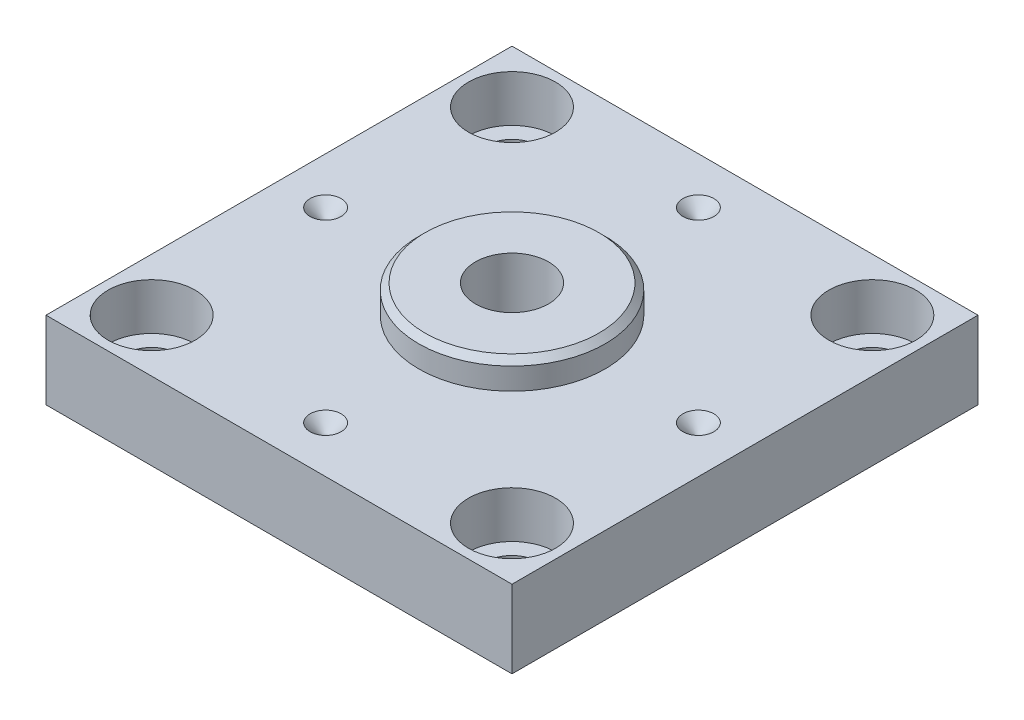
ISO-10303-21;
HEADER;
FILE_DESCRIPTION(('STEP AP214'),'2;1');
FILE_NAME('part.step','',(''),(''),'','','');
FILE_SCHEMA(('AUTOMOTIVE_DESIGN { 1 0 10303 214 1 1 1 1 }'));
ENDSEC;
DATA;
#1=APPLICATION_CONTEXT('core data for automotive mechanical design processes');
#2=APPLICATION_PROTOCOL_DEFINITION('international standard','automotive_design',2000,#1);
#3=PRODUCT_CONTEXT('',#1,'mechanical');
#4=PRODUCT('Part','Part','',(#3));
#5=PRODUCT_RELATED_PRODUCT_CATEGORY('part','',(#4));
#6=PRODUCT_DEFINITION_FORMATION('','',#4);
#7=PRODUCT_DEFINITION_CONTEXT('part definition',#1,'design');
#8=PRODUCT_DEFINITION('design','',#6,#7);
#9=PRODUCT_DEFINITION_SHAPE('','',#8);
#10=(LENGTH_UNIT() NAMED_UNIT(*) SI_UNIT(.MILLI.,.METRE.));
#11=(NAMED_UNIT(*) PLANE_ANGLE_UNIT() SI_UNIT($,.RADIAN.));
#12=(NAMED_UNIT(*) SI_UNIT($,.STERADIAN.) SOLID_ANGLE_UNIT());
#13=UNCERTAINTY_MEASURE_WITH_UNIT(LENGTH_MEASURE(1.E-05),#10,'distance_accuracy_value','');
#14=(GEOMETRIC_REPRESENTATION_CONTEXT(3) GLOBAL_UNCERTAINTY_ASSIGNED_CONTEXT((#13)) GLOBAL_UNIT_ASSIGNED_CONTEXT((#10,
#11,#12)) REPRESENTATION_CONTEXT('',''));
#15=CARTESIAN_POINT('',(0.,0.,0.));
#16=DIRECTION('',(0.,0.,1.));
#17=DIRECTION('',(1.,0.,0.));
#18=AXIS2_PLACEMENT_3D('',#15,#16,#17);
#19=CARTESIAN_POINT('',(-75.,25.,-75.));
#20=DIRECTION('',(1.,0.,0.));
#21=DIRECTION('',(0.,0.,-1.));
#22=AXIS2_PLACEMENT_3D('',#19,#20,#21);
#23=PLANE('',#22);
#24=DIRECTION('',(0.,0.,1.));
#25=VECTOR('',#24,1.);
#26=CARTESIAN_POINT('',(-75.,0.,-75.));
#27=LINE('',#26,#25);
#28=CARTESIAN_POINT('',(-75.,0.,-75.));
#29=VERTEX_POINT('',#28);
#30=CARTESIAN_POINT('',(-75.,0.,75.));
#31=VERTEX_POINT('',#30);
#32=EDGE_CURVE('E205',#29,#31,#27,.T.);
#33=ORIENTED_EDGE('',*,*,#32,.T.);
#34=DIRECTION('',(0.,-1.,0.));
#35=VECTOR('',#34,1.);
#36=CARTESIAN_POINT('',(-75.,25.,75.));
#37=LINE('',#36,#35);
#38=CARTESIAN_POINT('',(-75.,25.,75.));
#39=VERTEX_POINT('',#38);
#40=EDGE_CURVE('E210',#39,#31,#37,.T.);
#41=ORIENTED_EDGE('',*,*,#40,.F.);
#42=DIRECTION('',(0.,0.,1.));
#43=VECTOR('',#42,1.);
#44=CARTESIAN_POINT('',(-75.,25.,-75.));
#45=LINE('',#44,#43);
#46=CARTESIAN_POINT('',(-75.,25.,-75.));
#47=VERTEX_POINT('',#46);
#48=EDGE_CURVE('E211',#47,#39,#45,.T.);
#49=ORIENTED_EDGE('',*,*,#48,.F.);
#50=DIRECTION('',(0.,-1.,0.));
#51=VECTOR('',#50,1.);
#52=CARTESIAN_POINT('',(-75.,25.,-75.));
#53=LINE('',#52,#51);
#54=EDGE_CURVE('E221',#47,#29,#53,.T.);
#55=ORIENTED_EDGE('',*,*,#54,.T.);
#56=EDGE_LOOP('',(#33,#41,#49,#55));
#57=FACE_BOUND('',#56,.T.);
#58=ADVANCED_FACE('F45',(#57),#23,.F.);
#59=CARTESIAN_POINT('',(75.,25.,75.));
#60=DIRECTION('',(0.,0.,-1.));
#61=DIRECTION('',(-1.,0.,0.));
#62=AXIS2_PLACEMENT_3D('',#59,#60,#61);
#63=PLANE('',#62);
#64=DIRECTION('',(1.,0.,0.));
#65=VECTOR('',#64,1.);
#66=CARTESIAN_POINT('',(75.,0.,75.));
#67=LINE('',#66,#65);
#68=CARTESIAN_POINT('',(75.,0.,75.));
#69=VERTEX_POINT('',#68);
#70=EDGE_CURVE('E225',#31,#69,#67,.T.);
#71=ORIENTED_EDGE('',*,*,#70,.T.);
#72=DIRECTION('',(0.,-1.,0.));
#73=VECTOR('',#72,1.);
#74=CARTESIAN_POINT('',(75.,25.,75.));
#75=LINE('',#74,#73);
#76=CARTESIAN_POINT('',(75.,25.,75.));
#77=VERTEX_POINT('',#76);
#78=EDGE_CURVE('E237',#77,#69,#75,.T.);
#79=ORIENTED_EDGE('',*,*,#78,.F.);
#80=DIRECTION('',(1.,0.,0.));
#81=VECTOR('',#80,1.);
#82=CARTESIAN_POINT('',(75.,25.,75.));
#83=LINE('',#82,#81);
#84=EDGE_CURVE('E96',#39,#77,#83,.T.);
#85=ORIENTED_EDGE('',*,*,#84,.F.);
#86=ORIENTED_EDGE('',*,*,#40,.T.);
#87=EDGE_LOOP('',(#71,#79,#85,#86));
#88=FACE_BOUND('',#87,.T.);
#89=ADVANCED_FACE('F262',(#88),#63,.F.);
#90=CARTESIAN_POINT('',(75.,25.,-75.));
#91=DIRECTION('',(-1.,0.,0.));
#92=DIRECTION('',(0.,0.,1.));
#93=AXIS2_PLACEMENT_3D('',#90,#91,#92);
#94=PLANE('',#93);
#95=DIRECTION('',(0.,0.,-1.));
#96=VECTOR('',#95,1.);
#97=CARTESIAN_POINT('',(75.,0.,-75.));
#98=LINE('',#97,#96);
#99=CARTESIAN_POINT('',(75.,0.,-75.));
#100=VERTEX_POINT('',#99);
#101=EDGE_CURVE('E82',#69,#100,#98,.T.);
#102=ORIENTED_EDGE('',*,*,#101,.T.);
#103=DIRECTION('',(0.,-1.,0.));
#104=VECTOR('',#103,1.);
#105=CARTESIAN_POINT('',(75.,25.,-75.));
#106=LINE('',#105,#104);
#107=CARTESIAN_POINT('',(75.,25.,-75.));
#108=VERTEX_POINT('',#107);
#109=EDGE_CURVE('E234',#108,#100,#106,.T.);
#110=ORIENTED_EDGE('',*,*,#109,.F.);
#111=DIRECTION('',(0.,0.,-1.));
#112=VECTOR('',#111,1.);
#113=CARTESIAN_POINT('',(75.,25.,-75.));
#114=LINE('',#113,#112);
#115=EDGE_CURVE('E216',#77,#108,#114,.T.);
#116=ORIENTED_EDGE('',*,*,#115,.F.);
#117=ORIENTED_EDGE('',*,*,#78,.T.);
#118=EDGE_LOOP('',(#102,#110,#116,#117));
#119=FACE_BOUND('',#118,.T.);
#120=ADVANCED_FACE('F267',(#119),#94,.F.);
#121=CARTESIAN_POINT('',(75.,25.,-75.));
#122=DIRECTION('',(0.,0.,1.));
#123=DIRECTION('',(1.,0.,0.));
#124=AXIS2_PLACEMENT_3D('',#121,#122,#123);
#125=PLANE('',#124);
#126=DIRECTION('',(-1.,0.,0.));
#127=VECTOR('',#126,1.);
#128=CARTESIAN_POINT('',(75.,0.,-75.));
#129=LINE('',#128,#127);
#130=EDGE_CURVE('E88',#100,#29,#129,.T.);
#131=ORIENTED_EDGE('',*,*,#130,.T.);
#132=ORIENTED_EDGE('',*,*,#54,.F.);
#133=DIRECTION('',(-1.,0.,0.));
#134=VECTOR('',#133,1.);
#135=CARTESIAN_POINT('',(75.,25.,-75.));
#136=LINE('',#135,#134);
#137=EDGE_CURVE('E64',#108,#47,#136,.T.);
#138=ORIENTED_EDGE('',*,*,#137,.F.);
#139=ORIENTED_EDGE('',*,*,#109,.T.);
#140=EDGE_LOOP('',(#131,#132,#138,#139));
#141=FACE_BOUND('',#140,.T.);
#142=ADVANCED_FACE('F272',(#141),#125,.F.);
#143=CARTESIAN_POINT('',(0.,25.,0.));
#144=DIRECTION('',(0.,-1.,0.));
#145=DIRECTION('',(0.,0.,-1.));
#146=AXIS2_PLACEMENT_3D('',#143,#144,#145);
#147=PLANE('',#146);
#148=CARTESIAN_POINT('',(-6.28466640991764E-13,25.,-60.));
#149=DIRECTION('',(0.,-1.,0.));
#150=DIRECTION('',(0.,0.,1.));
#151=AXIS2_PLACEMENT_3D('',#148,#149,#150);
#152=CIRCLE('',#151,5.);
#153=CARTESIAN_POINT('',(-5.76094420909117E-13,25.,-55.));
#154=VERTEX_POINT('',#153);
#155=EDGE_CURVE('E116',#154,#154,#152,.T.);
#156=ORIENTED_EDGE('',*,*,#155,.T.);
#157=EDGE_LOOP('',(#156));
#158=FACE_BOUND('',#157,.T.);
#159=CARTESIAN_POINT('',(60.,25.,0.));
#160=DIRECTION('',(0.,-1.,0.));
#161=DIRECTION('',(-1.,0.,0.));
#162=AXIS2_PLACEMENT_3D('',#159,#160,#161);
#163=CIRCLE('',#162,5.);
#164=CARTESIAN_POINT('',(55.,25.,0.));
#165=VERTEX_POINT('',#164);
#166=EDGE_CURVE('E119',#165,#165,#163,.T.);
#167=ORIENTED_EDGE('',*,*,#166,.T.);
#168=EDGE_LOOP('',(#167));
#169=FACE_BOUND('',#168,.T.);
#170=CARTESIAN_POINT('',(2.09488880330588E-13,25.,60.));
#171=DIRECTION('',(0.,-1.,0.));
#172=DIRECTION('',(0.,0.,-1.));
#173=AXIS2_PLACEMENT_3D('',#170,#171,#172);
#174=CIRCLE('',#173,5.);
#175=CARTESIAN_POINT('',(1.92031473636372E-13,25.,55.));
#176=VERTEX_POINT('',#175);
#177=EDGE_CURVE('E123',#176,#176,#174,.T.);
#178=ORIENTED_EDGE('',*,*,#177,.T.);
#179=EDGE_LOOP('',(#178));
#180=FACE_BOUND('',#179,.T.);
#181=CARTESIAN_POINT('',(-60.,25.,0.));
#182=DIRECTION('',(0.,-1.,0.));
#183=DIRECTION('',(1.,0.,0.));
#184=AXIS2_PLACEMENT_3D('',#181,#182,#183);
#185=CIRCLE('',#184,5.);
#186=CARTESIAN_POINT('',(-55.,25.,0.));
#187=VERTEX_POINT('',#186);
#188=EDGE_CURVE('E129',#187,#187,#185,.T.);
#189=ORIENTED_EDGE('',*,*,#188,.T.);
#190=EDGE_LOOP('',(#189));
#191=FACE_BOUND('',#190,.T.);
#192=CARTESIAN_POINT('',(-58.,25.,58.));
#193=DIRECTION('',(0.,1.,0.));
#194=DIRECTION('',(0.,0.,1.));
#195=AXIS2_PLACEMENT_3D('',#192,#193,#194);
#196=CIRCLE('',#195,14.);
#197=CARTESIAN_POINT('',(-58.,25.,72.));
#198=VERTEX_POINT('',#197);
#199=EDGE_CURVE('E133',#198,#198,#196,.T.);
#200=ORIENTED_EDGE('',*,*,#199,.F.);
#201=EDGE_LOOP('',(#200));
#202=FACE_BOUND('',#201,.T.);
#203=CARTESIAN_POINT('',(58.,25.,58.));
#204=DIRECTION('',(0.,1.,0.));
#205=DIRECTION('',(0.,0.,1.));
#206=AXIS2_PLACEMENT_3D('',#203,#204,#205);
#207=CIRCLE('',#206,14.);
#208=CARTESIAN_POINT('',(58.,25.,72.));
#209=VERTEX_POINT('',#208);
#210=EDGE_CURVE('E149',#209,#209,#207,.T.);
#211=ORIENTED_EDGE('',*,*,#210,.F.);
#212=EDGE_LOOP('',(#211));
#213=FACE_BOUND('',#212,.T.);
#214=CARTESIAN_POINT('',(58.,25.,-58.));
#215=DIRECTION('',(0.,1.,0.));
#216=DIRECTION('',(0.,0.,1.));
#217=AXIS2_PLACEMENT_3D('',#214,#215,#216);
#218=CIRCLE('',#217,14.);
#219=CARTESIAN_POINT('',(58.,25.,-44.));
#220=VERTEX_POINT('',#219);
#221=EDGE_CURVE('E165',#220,#220,#218,.T.);
#222=ORIENTED_EDGE('',*,*,#221,.F.);
#223=EDGE_LOOP('',(#222));
#224=FACE_BOUND('',#223,.T.);
#225=CARTESIAN_POINT('',(-58.,25.,-58.));
#226=DIRECTION('',(0.,1.,0.));
#227=DIRECTION('',(0.,0.,1.));
#228=AXIS2_PLACEMENT_3D('',#225,#226,#227);
#229=CIRCLE('',#228,14.);
#230=CARTESIAN_POINT('',(-58.,25.,-44.));
#231=VERTEX_POINT('',#230);
#232=EDGE_CURVE('E181',#231,#231,#229,.T.);
#233=ORIENTED_EDGE('',*,*,#232,.F.);
#234=EDGE_LOOP('',(#233));
#235=FACE_BOUND('',#234,.T.);
#236=CARTESIAN_POINT('',(0.,25.,0.));
#237=DIRECTION('',(0.,1.,0.));
#238=DIRECTION('',(0.,0.,1.));
#239=AXIS2_PLACEMENT_3D('',#236,#237,#238);
#240=CIRCLE('',#239,30.);
#241=CARTESIAN_POINT('',(0.,25.,30.));
#242=VERTEX_POINT('',#241);
#243=EDGE_CURVE('E206',#242,#242,#240,.T.);
#244=ORIENTED_EDGE('',*,*,#243,.F.);
#245=EDGE_LOOP('',(#244));
#246=FACE_BOUND('',#245,.T.);
#247=ORIENTED_EDGE('',*,*,#48,.T.);
#248=ORIENTED_EDGE('',*,*,#84,.T.);
#249=ORIENTED_EDGE('',*,*,#115,.T.);
#250=ORIENTED_EDGE('',*,*,#137,.T.);
#251=EDGE_LOOP('',(#247,#248,#249,#250));
#252=FACE_BOUND('',#251,.T.);
#253=ADVANCED_FACE('F275',(#158,#169,#180,#191,#202,#213,#224,#235,#246,#252),#147,.F.);
#254=CARTESIAN_POINT('',(0.,0.,0.));
#255=DIRECTION('',(0.,-1.,0.));
#256=DIRECTION('',(0.,0.,-1.));
#257=AXIS2_PLACEMENT_3D('',#254,#255,#256);
#258=PLANE('',#257);
#259=CARTESIAN_POINT('',(-58.,0.,58.));
#260=DIRECTION('',(0.,1.,0.));
#261=DIRECTION('',(0.,0.,1.));
#262=AXIS2_PLACEMENT_3D('',#259,#260,#261);
#263=CIRCLE('',#262,8.50000000000001);
#264=CARTESIAN_POINT('',(-58.,0.,66.5));
#265=VERTEX_POINT('',#264);
#266=EDGE_CURVE('E145',#265,#265,#263,.T.);
#267=ORIENTED_EDGE('',*,*,#266,.T.);
#268=EDGE_LOOP('',(#267));
#269=FACE_BOUND('',#268,.T.);
#270=CARTESIAN_POINT('',(58.,0.,58.));
#271=DIRECTION('',(0.,1.,0.));
#272=DIRECTION('',(0.,0.,1.));
#273=AXIS2_PLACEMENT_3D('',#270,#271,#272);
#274=CIRCLE('',#273,8.50000000000001);
#275=CARTESIAN_POINT('',(58.,0.,66.5));
#276=VERTEX_POINT('',#275);
#277=EDGE_CURVE('E161',#276,#276,#274,.T.);
#278=ORIENTED_EDGE('',*,*,#277,.T.);
#279=EDGE_LOOP('',(#278));
#280=FACE_BOUND('',#279,.T.);
#281=CARTESIAN_POINT('',(58.,0.,-58.));
#282=DIRECTION('',(0.,1.,0.));
#283=DIRECTION('',(0.,0.,1.));
#284=AXIS2_PLACEMENT_3D('',#281,#282,#283);
#285=CIRCLE('',#284,8.50000000000001);
#286=CARTESIAN_POINT('',(58.,0.,-49.5));
#287=VERTEX_POINT('',#286);
#288=EDGE_CURVE('E177',#287,#287,#285,.T.);
#289=ORIENTED_EDGE('',*,*,#288,.T.);
#290=EDGE_LOOP('',(#289));
#291=FACE_BOUND('',#290,.T.);
#292=CARTESIAN_POINT('',(-58.,0.,-58.));
#293=DIRECTION('',(0.,1.,0.));
#294=DIRECTION('',(0.,0.,1.));
#295=AXIS2_PLACEMENT_3D('',#292,#293,#294);
#296=CIRCLE('',#295,8.50000000000001);
#297=CARTESIAN_POINT('',(-58.,0.,-49.5));
#298=VERTEX_POINT('',#297);
#299=EDGE_CURVE('E193',#298,#298,#296,.T.);
#300=ORIENTED_EDGE('',*,*,#299,.T.);
#301=EDGE_LOOP('',(#300));
#302=FACE_BOUND('',#301,.T.);
#303=CARTESIAN_POINT('',(0.,0.,0.));
#304=DIRECTION('',(0.,1.,0.));
#305=DIRECTION('',(0.,0.,1.));
#306=AXIS2_PLACEMENT_3D('',#303,#304,#305);
#307=CIRCLE('',#306,11.75);
#308=CARTESIAN_POINT('',(0.,0.,11.75));
#309=VERTEX_POINT('',#308);
#310=EDGE_CURVE('E201',#309,#309,#307,.T.);
#311=ORIENTED_EDGE('',*,*,#310,.T.);
#312=EDGE_LOOP('',(#311));
#313=FACE_BOUND('',#312,.T.);
#314=ORIENTED_EDGE('',*,*,#32,.F.);
#315=ORIENTED_EDGE('',*,*,#130,.F.);
#316=ORIENTED_EDGE('',*,*,#101,.F.);
#317=ORIENTED_EDGE('',*,*,#70,.F.);
#318=EDGE_LOOP('',(#314,#315,#316,#317));
#319=FACE_BOUND('',#318,.T.);
#320=ADVANCED_FACE('F276',(#269,#280,#291,#302,#313,#319),#258,.T.);
#321=CARTESIAN_POINT('',(0.,34.,0.));
#322=DIRECTION('',(0.,-1.,0.));
#323=DIRECTION('',(0.,0.,-1.));
#324=AXIS2_PLACEMENT_3D('',#321,#322,#323);
#325=CYLINDRICAL_SURFACE('',#324,30.);
#326=CARTESIAN_POINT('',(0.,32.,0.));
#327=DIRECTION('',(0.,1.,0.));
#328=DIRECTION('',(0.,0.,1.));
#329=AXIS2_PLACEMENT_3D('',#326,#327,#328);
#330=CIRCLE('',#329,30.);
#331=CARTESIAN_POINT('',(0.,32.,30.));
#332=VERTEX_POINT('',#331);
#333=EDGE_CURVE('E11',#332,#332,#330,.F.);
#334=ORIENTED_EDGE('',*,*,#333,.T.);
#335=EDGE_LOOP('',(#334));
#336=FACE_BOUND('',#335,.T.);
#337=ORIENTED_EDGE('',*,*,#243,.T.);
#338=EDGE_LOOP('',(#337));
#339=FACE_BOUND('',#338,.T.);
#340=ADVANCED_FACE('F257',(#336,#339),#325,.T.);
#341=CARTESIAN_POINT('',(0.,34.,0.));
#342=DIRECTION('',(0.,1.,0.));
#343=DIRECTION('',(0.,0.,1.));
#344=AXIS2_PLACEMENT_3D('',#341,#342,#343);
#345=PLANE('',#344);
#346=CARTESIAN_POINT('',(0.,34.,0.));
#347=DIRECTION('',(0.,1.,0.));
#348=DIRECTION('',(0.,0.,1.));
#349=AXIS2_PLACEMENT_3D('',#346,#347,#348);
#350=CIRCLE('',#349,11.75);
#351=CARTESIAN_POINT('',(0.,34.,11.75));
#352=VERTEX_POINT('',#351);
#353=EDGE_CURVE('E197',#352,#352,#350,.T.);
#354=ORIENTED_EDGE('',*,*,#353,.F.);
#355=EDGE_LOOP('',(#354));
#356=FACE_BOUND('',#355,.T.);
#357=CARTESIAN_POINT('',(0.,34.,0.));
#358=DIRECTION('',(0.,1.,0.));
#359=DIRECTION('',(0.,0.,1.));
#360=AXIS2_PLACEMENT_3D('',#357,#358,#359);
#361=CIRCLE('',#360,28.);
#362=CARTESIAN_POINT('',(0.,34.,28.));
#363=VERTEX_POINT('',#362);
#364=EDGE_CURVE('E56',#363,#363,#361,.T.);
#365=ORIENTED_EDGE('',*,*,#364,.T.);
#366=EDGE_LOOP('',(#365));
#367=FACE_BOUND('',#366,.T.);
#368=ADVANCED_FACE('F245',(#356,#367),#345,.T.);
#369=CARTESIAN_POINT('',(0.,34.,0.));
#370=DIRECTION('',(0.,-1.,0.));
#371=DIRECTION('',(0.,0.,-1.));
#372=AXIS2_PLACEMENT_3D('',#369,#370,#371);
#373=CONICAL_SURFACE('',#372,28.,0.785398163397451);
#374=ORIENTED_EDGE('',*,*,#333,.F.);
#375=EDGE_LOOP('',(#374));
#376=FACE_BOUND('',#375,.T.);
#377=ORIENTED_EDGE('',*,*,#364,.F.);
#378=EDGE_LOOP('',(#377));
#379=FACE_BOUND('',#378,.T.);
#380=ADVANCED_FACE('F48',(#376,#379),#373,.T.);
#381=CARTESIAN_POINT('',(0.,34.,0.));
#382=DIRECTION('',(0.,1.,0.));
#383=DIRECTION('',(0.,0.,1.));
#384=AXIS2_PLACEMENT_3D('',#381,#382,#383);
#385=CYLINDRICAL_SURFACE('',#384,11.75);
#386=ORIENTED_EDGE('',*,*,#310,.F.);
#387=EDGE_LOOP('',(#386));
#388=FACE_BOUND('',#387,.T.);
#389=ORIENTED_EDGE('',*,*,#353,.T.);
#390=EDGE_LOOP('',(#389));
#391=FACE_BOUND('',#390,.T.);
#392=ADVANCED_FACE('F248',(#388,#391),#385,.F.);
#393=CARTESIAN_POINT('',(-58.,25.,-58.));
#394=DIRECTION('',(0.,1.,0.));
#395=DIRECTION('',(0.,0.,1.));
#396=AXIS2_PLACEMENT_3D('',#393,#394,#395);
#397=CYLINDRICAL_SURFACE('',#396,8.50000000000001);
#398=ORIENTED_EDGE('',*,*,#299,.F.);
#399=EDGE_LOOP('',(#398));
#400=FACE_BOUND('',#399,.T.);
#401=CARTESIAN_POINT('',(-58.,10.,-58.));
#402=DIRECTION('',(0.,1.,0.));
#403=DIRECTION('',(0.,0.,1.));
#404=AXIS2_PLACEMENT_3D('',#401,#402,#403);
#405=CIRCLE('',#404,8.50000000000001);
#406=CARTESIAN_POINT('',(-58.,10.,-49.5));
#407=VERTEX_POINT('',#406);
#408=EDGE_CURVE('E189',#407,#407,#405,.T.);
#409=ORIENTED_EDGE('',*,*,#408,.T.);
#410=EDGE_LOOP('',(#409));
#411=FACE_BOUND('',#410,.T.);
#412=ADVANCED_FACE('F254',(#400,#411),#397,.F.);
#413=CARTESIAN_POINT('',(-49.5,10.,-58.));
#414=DIRECTION('',(0.,-1.,0.));
#415=DIRECTION('',(0.,0.,-1.));
#416=AXIS2_PLACEMENT_3D('',#413,#414,#415);
#417=PLANE('',#416);
#418=ORIENTED_EDGE('',*,*,#408,.F.);
#419=EDGE_LOOP('',(#418));
#420=FACE_BOUND('',#419,.T.);
#421=CARTESIAN_POINT('',(-58.,10.,-58.));
#422=DIRECTION('',(0.,1.,0.));
#423=DIRECTION('',(0.,0.,1.));
#424=AXIS2_PLACEMENT_3D('',#421,#422,#423);
#425=CIRCLE('',#424,14.);
#426=CARTESIAN_POINT('',(-58.,10.,-44.));
#427=VERTEX_POINT('',#426);
#428=EDGE_CURVE('E185',#427,#427,#425,.T.);
#429=ORIENTED_EDGE('',*,*,#428,.T.);
#430=EDGE_LOOP('',(#429));
#431=FACE_BOUND('',#430,.T.);
#432=ADVANCED_FACE('F287',(#420,#431),#417,.F.);
#433=CARTESIAN_POINT('',(-58.,25.,-58.));
#434=DIRECTION('',(0.,1.,0.));
#435=DIRECTION('',(0.,0.,1.));
#436=AXIS2_PLACEMENT_3D('',#433,#434,#435);
#437=CYLINDRICAL_SURFACE('',#436,14.);
#438=ORIENTED_EDGE('',*,*,#428,.F.);
#439=EDGE_LOOP('',(#438));
#440=FACE_BOUND('',#439,.T.);
#441=ORIENTED_EDGE('',*,*,#232,.T.);
#442=EDGE_LOOP('',(#441));
#443=FACE_BOUND('',#442,.T.);
#444=ADVANCED_FACE('F291',(#440,#443),#437,.F.);
#445=CARTESIAN_POINT('',(58.,25.,-58.));
#446=DIRECTION('',(0.,1.,0.));
#447=DIRECTION('',(0.,0.,1.));
#448=AXIS2_PLACEMENT_3D('',#445,#446,#447);
#449=CYLINDRICAL_SURFACE('',#448,8.50000000000001);
#450=ORIENTED_EDGE('',*,*,#288,.F.);
#451=EDGE_LOOP('',(#450));
#452=FACE_BOUND('',#451,.T.);
#453=CARTESIAN_POINT('',(58.,10.,-58.));
#454=DIRECTION('',(0.,1.,0.));
#455=DIRECTION('',(0.,0.,1.));
#456=AXIS2_PLACEMENT_3D('',#453,#454,#455);
#457=CIRCLE('',#456,8.50000000000001);
#458=CARTESIAN_POINT('',(58.,10.,-49.5));
#459=VERTEX_POINT('',#458);
#460=EDGE_CURVE('E173',#459,#459,#457,.T.);
#461=ORIENTED_EDGE('',*,*,#460,.T.);
#462=EDGE_LOOP('',(#461));
#463=FACE_BOUND('',#462,.T.);
#464=ADVANCED_FACE('F295',(#452,#463),#449,.F.);
#465=CARTESIAN_POINT('',(66.5,10.,-58.));
#466=DIRECTION('',(0.,-1.,0.));
#467=DIRECTION('',(0.,0.,-1.));
#468=AXIS2_PLACEMENT_3D('',#465,#466,#467);
#469=PLANE('',#468);
#470=ORIENTED_EDGE('',*,*,#460,.F.);
#471=EDGE_LOOP('',(#470));
#472=FACE_BOUND('',#471,.T.);
#473=CARTESIAN_POINT('',(58.,10.,-58.));
#474=DIRECTION('',(0.,1.,0.));
#475=DIRECTION('',(0.,0.,1.));
#476=AXIS2_PLACEMENT_3D('',#473,#474,#475);
#477=CIRCLE('',#476,14.);
#478=CARTESIAN_POINT('',(58.,10.,-44.));
#479=VERTEX_POINT('',#478);
#480=EDGE_CURVE('E169',#479,#479,#477,.T.);
#481=ORIENTED_EDGE('',*,*,#480,.T.);
#482=EDGE_LOOP('',(#481));
#483=FACE_BOUND('',#482,.T.);
#484=ADVANCED_FACE('F299',(#472,#483),#469,.F.);
#485=CARTESIAN_POINT('',(58.,25.,-58.));
#486=DIRECTION('',(0.,1.,0.));
#487=DIRECTION('',(0.,0.,1.));
#488=AXIS2_PLACEMENT_3D('',#485,#486,#487);
#489=CYLINDRICAL_SURFACE('',#488,14.);
#490=ORIENTED_EDGE('',*,*,#480,.F.);
#491=EDGE_LOOP('',(#490));
#492=FACE_BOUND('',#491,.T.);
#493=ORIENTED_EDGE('',*,*,#221,.T.);
#494=EDGE_LOOP('',(#493));
#495=FACE_BOUND('',#494,.T.);
#496=ADVANCED_FACE('F303',(#492,#495),#489,.F.);
#497=CARTESIAN_POINT('',(58.,25.,58.));
#498=DIRECTION('',(0.,1.,0.));
#499=DIRECTION('',(0.,0.,1.));
#500=AXIS2_PLACEMENT_3D('',#497,#498,#499);
#501=CYLINDRICAL_SURFACE('',#500,8.50000000000001);
#502=ORIENTED_EDGE('',*,*,#277,.F.);
#503=EDGE_LOOP('',(#502));
#504=FACE_BOUND('',#503,.T.);
#505=CARTESIAN_POINT('',(58.,10.,58.));
#506=DIRECTION('',(0.,1.,0.));
#507=DIRECTION('',(0.,0.,1.));
#508=AXIS2_PLACEMENT_3D('',#505,#506,#507);
#509=CIRCLE('',#508,8.50000000000001);
#510=CARTESIAN_POINT('',(58.,10.,66.5));
#511=VERTEX_POINT('',#510);
#512=EDGE_CURVE('E157',#511,#511,#509,.T.);
#513=ORIENTED_EDGE('',*,*,#512,.T.);
#514=EDGE_LOOP('',(#513));
#515=FACE_BOUND('',#514,.T.);
#516=ADVANCED_FACE('F307',(#504,#515),#501,.F.);
#517=CARTESIAN_POINT('',(66.5,10.,58.));
#518=DIRECTION('',(0.,-1.,0.));
#519=DIRECTION('',(0.,0.,-1.));
#520=AXIS2_PLACEMENT_3D('',#517,#518,#519);
#521=PLANE('',#520);
#522=ORIENTED_EDGE('',*,*,#512,.F.);
#523=EDGE_LOOP('',(#522));
#524=FACE_BOUND('',#523,.T.);
#525=CARTESIAN_POINT('',(58.,10.,58.));
#526=DIRECTION('',(0.,1.,0.));
#527=DIRECTION('',(0.,0.,1.));
#528=AXIS2_PLACEMENT_3D('',#525,#526,#527);
#529=CIRCLE('',#528,14.);
#530=CARTESIAN_POINT('',(58.,10.,72.));
#531=VERTEX_POINT('',#530);
#532=EDGE_CURVE('E153',#531,#531,#529,.T.);
#533=ORIENTED_EDGE('',*,*,#532,.T.);
#534=EDGE_LOOP('',(#533));
#535=FACE_BOUND('',#534,.T.);
#536=ADVANCED_FACE('F311',(#524,#535),#521,.F.);
#537=CARTESIAN_POINT('',(58.,25.,58.));
#538=DIRECTION('',(0.,1.,0.));
#539=DIRECTION('',(0.,0.,1.));
#540=AXIS2_PLACEMENT_3D('',#537,#538,#539);
#541=CYLINDRICAL_SURFACE('',#540,14.);
#542=ORIENTED_EDGE('',*,*,#532,.F.);
#543=EDGE_LOOP('',(#542));
#544=FACE_BOUND('',#543,.T.);
#545=ORIENTED_EDGE('',*,*,#210,.T.);
#546=EDGE_LOOP('',(#545));
#547=FACE_BOUND('',#546,.T.);
#548=ADVANCED_FACE('F315',(#544,#547),#541,.F.);
#549=CARTESIAN_POINT('',(-58.,25.,58.));
#550=DIRECTION('',(0.,1.,0.));
#551=DIRECTION('',(0.,0.,1.));
#552=AXIS2_PLACEMENT_3D('',#549,#550,#551);
#553=CYLINDRICAL_SURFACE('',#552,8.50000000000001);
#554=ORIENTED_EDGE('',*,*,#266,.F.);
#555=EDGE_LOOP('',(#554));
#556=FACE_BOUND('',#555,.T.);
#557=CARTESIAN_POINT('',(-58.,10.,58.));
#558=DIRECTION('',(0.,1.,0.));
#559=DIRECTION('',(0.,0.,1.));
#560=AXIS2_PLACEMENT_3D('',#557,#558,#559);
#561=CIRCLE('',#560,8.50000000000001);
#562=CARTESIAN_POINT('',(-58.,10.,66.5));
#563=VERTEX_POINT('',#562);
#564=EDGE_CURVE('E141',#563,#563,#561,.T.);
#565=ORIENTED_EDGE('',*,*,#564,.T.);
#566=EDGE_LOOP('',(#565));
#567=FACE_BOUND('',#566,.T.);
#568=ADVANCED_FACE('F319',(#556,#567),#553,.F.);
#569=CARTESIAN_POINT('',(-49.5,10.,58.));
#570=DIRECTION('',(0.,-1.,0.));
#571=DIRECTION('',(0.,0.,-1.));
#572=AXIS2_PLACEMENT_3D('',#569,#570,#571);
#573=PLANE('',#572);
#574=ORIENTED_EDGE('',*,*,#564,.F.);
#575=EDGE_LOOP('',(#574));
#576=FACE_BOUND('',#575,.T.);
#577=CARTESIAN_POINT('',(-58.,10.,58.));
#578=DIRECTION('',(0.,1.,0.));
#579=DIRECTION('',(0.,0.,1.));
#580=AXIS2_PLACEMENT_3D('',#577,#578,#579);
#581=CIRCLE('',#580,14.);
#582=CARTESIAN_POINT('',(-58.,10.,72.));
#583=VERTEX_POINT('',#582);
#584=EDGE_CURVE('E137',#583,#583,#581,.T.);
#585=ORIENTED_EDGE('',*,*,#584,.T.);
#586=EDGE_LOOP('',(#585));
#587=FACE_BOUND('',#586,.T.);
#588=ADVANCED_FACE('F323',(#576,#587),#573,.F.);
#589=CARTESIAN_POINT('',(-58.,25.,58.));
#590=DIRECTION('',(0.,1.,0.));
#591=DIRECTION('',(0.,0.,1.));
#592=AXIS2_PLACEMENT_3D('',#589,#590,#591);
#593=CYLINDRICAL_SURFACE('',#592,14.);
#594=ORIENTED_EDGE('',*,*,#584,.F.);
#595=EDGE_LOOP('',(#594));
#596=FACE_BOUND('',#595,.T.);
#597=ORIENTED_EDGE('',*,*,#199,.T.);
#598=EDGE_LOOP('',(#597));
#599=FACE_BOUND('',#598,.T.);
#600=ADVANCED_FACE('F327',(#596,#599),#593,.F.);
#601=CARTESIAN_POINT('',(-60.,25.,0.));
#602=DIRECTION('',(0.,1.,0.));
#603=DIRECTION('',(-1.,0.,0.));
#604=AXIS2_PLACEMENT_3D('',#601,#602,#603);
#605=CONICAL_SURFACE('',#604,5.,0.785398163397448);
#606=CARTESIAN_POINT('',(-60.,20.,0.));
#607=VERTEX_POINT('',#606);
#608=VERTEX_LOOP('',#607);
#609=FACE_BOUND('',#608,.T.);
#610=ORIENTED_EDGE('',*,*,#188,.F.);
#611=EDGE_LOOP('',(#610));
#612=FACE_BOUND('',#611,.T.);
#613=ADVANCED_FACE('F331',(#609,#612),#605,.F.);
#614=CARTESIAN_POINT('',(2.09488880330588E-13,25.,60.));
#615=DIRECTION('',(0.,1.,0.));
#616=DIRECTION('',(0.,0.,1.));
#617=AXIS2_PLACEMENT_3D('',#614,#615,#616);
#618=CONICAL_SURFACE('',#617,5.,0.785398163397448);
#619=CARTESIAN_POINT('',(2.09488880330588E-13,20.,60.));
#620=VERTEX_POINT('',#619);
#621=VERTEX_LOOP('',#620);
#622=FACE_BOUND('',#621,.T.);
#623=ORIENTED_EDGE('',*,*,#177,.F.);
#624=EDGE_LOOP('',(#623));
#625=FACE_BOUND('',#624,.T.);
#626=ADVANCED_FACE('F335',(#622,#625),#618,.F.);
#627=CARTESIAN_POINT('',(60.,25.,0.));
#628=DIRECTION('',(0.,1.,0.));
#629=DIRECTION('',(1.,0.,0.));
#630=AXIS2_PLACEMENT_3D('',#627,#628,#629);
#631=CONICAL_SURFACE('',#630,5.,0.785398163397448);
#632=CARTESIAN_POINT('',(60.,20.,0.));
#633=VERTEX_POINT('',#632);
#634=VERTEX_LOOP('',#633);
#635=FACE_BOUND('',#634,.T.);
#636=ORIENTED_EDGE('',*,*,#166,.F.);
#637=EDGE_LOOP('',(#636));
#638=FACE_BOUND('',#637,.T.);
#639=ADVANCED_FACE('F112',(#635,#638),#631,.F.);
#640=CARTESIAN_POINT('',(-6.28466640991764E-13,25.,-60.));
#641=DIRECTION('',(0.,1.,0.));
#642=DIRECTION('',(0.,0.,-1.));
#643=AXIS2_PLACEMENT_3D('',#640,#641,#642);
#644=CONICAL_SURFACE('',#643,5.,0.785398163397448);
#645=CARTESIAN_POINT('',(-6.28466640991764E-13,20.,-60.));
#646=VERTEX_POINT('',#645);
#647=VERTEX_LOOP('',#646);
#648=FACE_BOUND('',#647,.T.);
#649=ORIENTED_EDGE('',*,*,#155,.F.);
#650=EDGE_LOOP('',(#649));
#651=FACE_BOUND('',#650,.T.);
#652=ADVANCED_FACE('F109',(#648,#651),#644,.F.);
#653=CLOSED_SHELL('',(#58,#89,#120,#142,#253,#320,#340,#368,#380,#392,#412,#432,#444,#464,#484,
#496,#516,#536,#548,#568,#588,#600,#613,#626,#639,#652));
#654=MANIFOLD_SOLID_BREP('B2',#653);
#655=ADVANCED_BREP_SHAPE_REPRESENTATION('',(#18,#654),#14);
#656=SHAPE_DEFINITION_REPRESENTATION(#9,#655);
ENDSEC;
END-ISO-10303-21;
